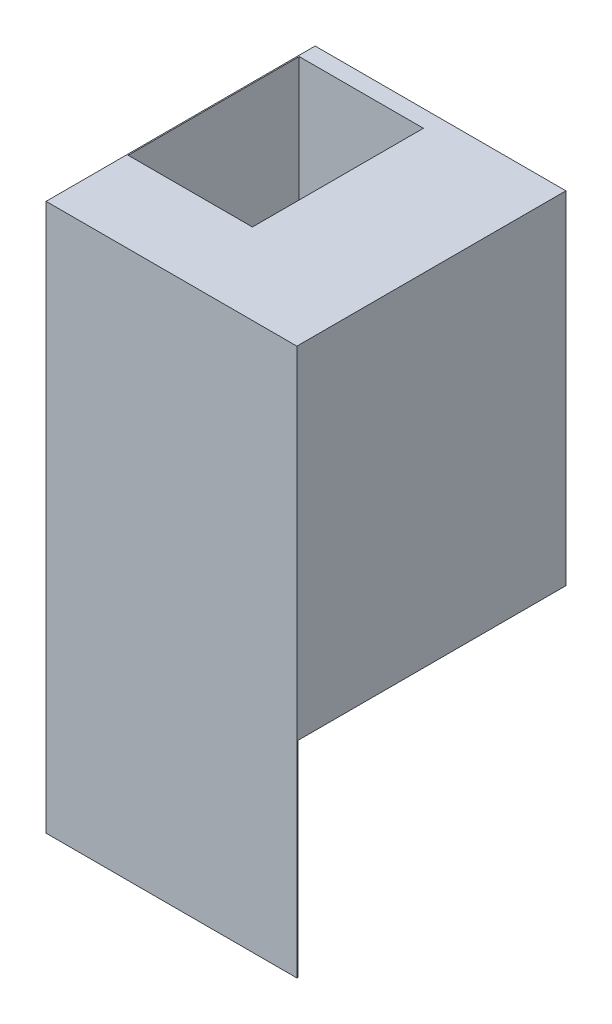
ISO-10303-21;
HEADER;
FILE_DESCRIPTION(('STEP AP214'),'2;1');
FILE_NAME('part.step','',(''),(''),'','','');
FILE_SCHEMA(('AUTOMOTIVE_DESIGN { 1 0 10303 214 1 1 1 1 }'));
ENDSEC;
DATA;
#1=APPLICATION_CONTEXT('core data for automotive mechanical design processes');
#2=APPLICATION_PROTOCOL_DEFINITION('international standard','automotive_design',2000,#1);
#3=PRODUCT_CONTEXT('',#1,'mechanical');
#4=PRODUCT('Part','Part','',(#3));
#5=PRODUCT_RELATED_PRODUCT_CATEGORY('part','',(#4));
#6=PRODUCT_DEFINITION_FORMATION('','',#4);
#7=PRODUCT_DEFINITION_CONTEXT('part definition',#1,'design');
#8=PRODUCT_DEFINITION('design','',#6,#7);
#9=PRODUCT_DEFINITION_SHAPE('','',#8);
#10=(LENGTH_UNIT() NAMED_UNIT(*) SI_UNIT(.MILLI.,.METRE.));
#11=(NAMED_UNIT(*) PLANE_ANGLE_UNIT() SI_UNIT($,.RADIAN.));
#12=(NAMED_UNIT(*) SI_UNIT($,.STERADIAN.) SOLID_ANGLE_UNIT());
#13=UNCERTAINTY_MEASURE_WITH_UNIT(LENGTH_MEASURE(1.E-05),#10,'distance_accuracy_value','');
#14=(GEOMETRIC_REPRESENTATION_CONTEXT(3) GLOBAL_UNCERTAINTY_ASSIGNED_CONTEXT((#13)) GLOBAL_UNIT_ASSIGNED_CONTEXT((#10,
#11,#12)) REPRESENTATION_CONTEXT('',''));
#15=CARTESIAN_POINT('',(0.,0.,0.));
#16=DIRECTION('',(0.,0.,1.));
#17=DIRECTION('',(1.,0.,0.));
#18=AXIS2_PLACEMENT_3D('',#15,#16,#17);
#19=CARTESIAN_POINT('',(0.,0.,0.));
#20=DIRECTION('',(0.,0.,-1.));
#21=DIRECTION('',(-1.,0.,0.));
#22=AXIS2_PLACEMENT_3D('',#19,#20,#21);
#23=PLANE('',#22);
#24=DIRECTION('',(1.,0.,0.));
#25=VECTOR('',#24,1.);
#26=CARTESIAN_POINT('',(-19.7567354025992,-134.460095901161,0.));
#27=LINE('',#26,#25);
#28=CARTESIAN_POINT('',(-9.7567354025992,-134.460095901161,0.));
#29=VERTEX_POINT('',#28);
#30=CARTESIAN_POINT('',(2180.2432645974,-134.460095901161,0.));
#31=VERTEX_POINT('',#30);
#32=EDGE_CURVE('E49',#29,#31,#27,.T.);
#33=ORIENTED_EDGE('',*,*,#32,.F.);
#34=DIRECTION('',(0.,1.,0.));
#35=VECTOR('',#34,1.);
#36=CARTESIAN_POINT('',(-9.75673540259921,-134.460095901161,0.));
#37=LINE('',#36,#35);
#38=CARTESIAN_POINT('',(-9.75673540259914,3665.53990409884,0.));
#39=VERTEX_POINT('',#38);
#40=EDGE_CURVE('E54',#29,#39,#37,.T.);
#41=ORIENTED_EDGE('',*,*,#40,.T.);
#42=DIRECTION('',(-1.,0.,0.));
#43=VECTOR('',#42,1.);
#44=CARTESIAN_POINT('',(1080.2432645974,3665.53990409884,0.));
#45=LINE('',#44,#43);
#46=CARTESIAN_POINT('',(1080.2432645974,3665.53990409884,0.));
#47=VERTEX_POINT('',#46);
#48=EDGE_CURVE('E317',#47,#39,#45,.T.);
#49=ORIENTED_EDGE('',*,*,#48,.F.);
#50=DIRECTION('',(0.,1.,0.));
#51=VECTOR('',#50,1.);
#52=CARTESIAN_POINT('',(1080.2432645974,4665.53990409884,0.));
#53=LINE('',#52,#51);
#54=CARTESIAN_POINT('',(1080.2432645974,3115.53990409884,0.));
#55=VERTEX_POINT('',#54);
#56=EDGE_CURVE('E287',#55,#47,#53,.T.);
#57=ORIENTED_EDGE('',*,*,#56,.F.);
#58=DIRECTION('',(-1.,0.,0.));
#59=VECTOR('',#58,1.);
#60=CARTESIAN_POINT('',(2180.2442645974,3115.53990409884,0.));
#61=LINE('',#60,#59);
#62=CARTESIAN_POINT('',(1090.2432645974,3115.53990409884,-3.5527136788005E-12));
#63=VERTEX_POINT('',#62);
#64=EDGE_CURVE('E249',#63,#55,#61,.T.);
#65=ORIENTED_EDGE('',*,*,#64,.F.);
#66=DIRECTION('',(0.,1.,0.));
#67=VECTOR('',#66,1.);
#68=CARTESIAN_POINT('',(1090.2432645974,1675.53990409884,-3.5527136788005E-12));
#69=LINE('',#68,#67);
#70=CARTESIAN_POINT('',(1090.2432645974,4655.53990409884,-3.5527136788005E-12));
#71=VERTEX_POINT('',#70);
#72=EDGE_CURVE('E266',#63,#71,#69,.T.);
#73=ORIENTED_EDGE('',*,*,#72,.T.);
#74=DIRECTION('',(1.,0.,0.));
#75=VECTOR('',#74,1.);
#76=CARTESIAN_POINT('',(2170.2432645974,4655.53990409884,-3.5527136788005E-12));
#77=LINE('',#76,#75);
#78=CARTESIAN_POINT('',(2170.2432645974,4655.53990409884,-3.5527136788005E-12));
#79=VERTEX_POINT('',#78);
#80=EDGE_CURVE('E270',#71,#79,#77,.T.);
#81=ORIENTED_EDGE('',*,*,#80,.T.);
#82=DIRECTION('',(0.,-1.,0.));
#83=VECTOR('',#82,1.);
#84=CARTESIAN_POINT('',(2170.2432645974,1675.53990409884,-3.5527136788005E-12));
#85=LINE('',#84,#83);
#86=CARTESIAN_POINT('',(2170.2432645974,1675.53990409884,-3.5527136788005E-12));
#87=VERTEX_POINT('',#86);
#88=EDGE_CURVE('E259',#79,#87,#85,.T.);
#89=ORIENTED_EDGE('',*,*,#88,.T.);
#90=DIRECTION('',(-1.,0.,0.));
#91=VECTOR('',#90,1.);
#92=CARTESIAN_POINT('',(2170.2432645974,1675.53990409884,-3.5527136788005E-12));
#93=LINE('',#92,#91);
#94=CARTESIAN_POINT('',(1090.2432645974,1675.53990409884,-3.5527136788005E-12));
#95=VERTEX_POINT('',#94);
#96=EDGE_CURVE('E262',#87,#95,#93,.T.);
#97=ORIENTED_EDGE('',*,*,#96,.T.);
#98=CARTESIAN_POINT('',(1090.2432645974,2215.53990409884,0.));
#99=VERTEX_POINT('',#98);
#100=EDGE_CURVE('E267',#95,#99,#69,.T.);
#101=ORIENTED_EDGE('',*,*,#100,.T.);
#102=DIRECTION('',(-1.,0.,0.));
#103=VECTOR('',#102,1.);
#104=CARTESIAN_POINT('',(2180.2442645974,2215.53990409884,0.));
#105=LINE('',#104,#103);
#106=CARTESIAN_POINT('',(1080.2432645974,2215.53990409884,0.));
#107=VERTEX_POINT('',#106);
#108=EDGE_CURVE('E246',#99,#107,#105,.T.);
#109=ORIENTED_EDGE('',*,*,#108,.T.);
#110=CARTESIAN_POINT('',(1080.2432645974,1665.53990409884,0.));
#111=VERTEX_POINT('',#110);
#112=EDGE_CURVE('E301',#111,#107,#53,.T.);
#113=ORIENTED_EDGE('',*,*,#112,.F.);
#114=DIRECTION('',(-1.,0.,0.));
#115=VECTOR('',#114,1.);
#116=CARTESIAN_POINT('',(2180.2432645974,1665.53990409884,0.));
#117=LINE('',#116,#115);
#118=CARTESIAN_POINT('',(2180.2432645974,1665.53990409884,0.));
#119=VERTEX_POINT('',#118);
#120=EDGE_CURVE('E300',#119,#111,#117,.T.);
#121=ORIENTED_EDGE('',*,*,#120,.F.);
#122=DIRECTION('',(0.,1.,0.));
#123=VECTOR('',#122,1.);
#124=CARTESIAN_POINT('',(2180.2432645974,-134.460095901161,0.));
#125=LINE('',#124,#123);
#126=EDGE_CURVE('E323',#31,#119,#125,.T.);
#127=ORIENTED_EDGE('',*,*,#126,.F.);
#128=EDGE_LOOP('',(#33,#41,#49,#57,#65,#73,#81,#89,#97,#101,#109,#113,#121,#127));
#129=FACE_BOUND('',#128,.T.);
#130=ADVANCED_FACE('F34',(#129),#23,.T.);
#131=CARTESIAN_POINT('',(1080.2432645974,3665.53990409884,0.));
#132=DIRECTION('',(0.,0.573462344363328,0.81923192051904));
#133=DIRECTION('',(0.,-0.819231920519041,0.573462344363328));
#134=AXIS2_PLACEMENT_3D('',#131,#132,#133);
#135=PLANE('',#134);
#136=DIRECTION('',(0.,0.81923192051904,-0.573462344363328));
#137=VECTOR('',#136,1.);
#138=CARTESIAN_POINT('',(-9.7567354025992,3665.53990409884,0.));
#139=LINE('',#138,#137);
#140=CARTESIAN_POINT('',(-9.75673540259914,4665.53990409884,-700.));
#141=VERTEX_POINT('',#140);
#142=EDGE_CURVE('E361',#39,#141,#139,.T.);
#143=ORIENTED_EDGE('',*,*,#142,.T.);
#144=DIRECTION('',(-1.,0.,0.));
#145=VECTOR('',#144,1.);
#146=CARTESIAN_POINT('',(1080.2432645974,4665.53990409884,-700.));
#147=LINE('',#146,#145);
#148=CARTESIAN_POINT('',(1080.2432645974,4665.53990409884,-700.));
#149=VERTEX_POINT('',#148);
#150=EDGE_CURVE('E314',#149,#141,#147,.T.);
#151=ORIENTED_EDGE('',*,*,#150,.F.);
#152=DIRECTION('',(0.,0.81923192051904,-0.573462344363328));
#153=VECTOR('',#152,1.);
#154=CARTESIAN_POINT('',(1080.2432645974,3665.53990409884,0.));
#155=LINE('',#154,#153);
#156=EDGE_CURVE('E311',#47,#149,#155,.T.);
#157=ORIENTED_EDGE('',*,*,#156,.F.);
#158=ORIENTED_EDGE('',*,*,#48,.T.);
#159=EDGE_LOOP('',(#143,#151,#157,#158));
#160=FACE_BOUND('',#159,.T.);
#161=ADVANCED_FACE('F365',(#160),#135,.F.);
#162=CARTESIAN_POINT('',(2180.2432645974,1665.53990409884,-2200.));
#163=DIRECTION('',(0.,1.,0.));
#164=DIRECTION('',(0.,0.,1.));
#165=AXIS2_PLACEMENT_3D('',#162,#163,#164);
#166=PLANE('',#165);
#167=DIRECTION('',(0.,0.,1.));
#168=VECTOR('',#167,1.);
#169=CARTESIAN_POINT('',(-9.75673540259914,1665.53990409884,-2200.));
#170=LINE('',#169,#168);
#171=CARTESIAN_POINT('',(-9.75673540259914,1665.53990409884,-2350.));
#172=VERTEX_POINT('',#171);
#173=CARTESIAN_POINT('',(-9.75673540259914,1665.53990409884,-2200.));
#174=VERTEX_POINT('',#173);
#175=EDGE_CURVE('E202',#172,#174,#170,.T.);
#176=ORIENTED_EDGE('',*,*,#175,.F.);
#177=DIRECTION('',(1.,0.,0.));
#178=VECTOR('',#177,1.);
#179=CARTESIAN_POINT('',(2180.2432645974,1665.53990409884,-2350.));
#180=LINE('',#179,#178);
#181=CARTESIAN_POINT('',(2180.2432645974,1665.53990409884,-2350.));
#182=VERTEX_POINT('',#181);
#183=EDGE_CURVE('E183',#172,#182,#180,.T.);
#184=ORIENTED_EDGE('',*,*,#183,.T.);
#185=DIRECTION('',(0.,0.,1.));
#186=VECTOR('',#185,1.);
#187=CARTESIAN_POINT('',(2180.2432645974,1665.53990409884,-2200.));
#188=LINE('',#187,#186);
#189=EDGE_CURVE('E307',#182,#119,#188,.T.);
#190=ORIENTED_EDGE('',*,*,#189,.T.);
#191=ORIENTED_EDGE('',*,*,#120,.T.);
#192=DIRECTION('',(0.,0.,1.));
#193=VECTOR('',#192,1.);
#194=CARTESIAN_POINT('',(1080.2432645974,1665.53990409884,-2200.));
#195=LINE('',#194,#193);
#196=CARTESIAN_POINT('',(1080.2432645974,1665.53990409884,-2200.));
#197=VERTEX_POINT('',#196);
#198=EDGE_CURVE('E299',#197,#111,#195,.T.);
#199=ORIENTED_EDGE('',*,*,#198,.F.);
#200=DIRECTION('',(-1.,0.,0.));
#201=VECTOR('',#200,1.);
#202=CARTESIAN_POINT('',(2180.2432645974,1665.53990409884,-2200.));
#203=LINE('',#202,#201);
#204=EDGE_CURVE('E204',#197,#174,#203,.T.);
#205=ORIENTED_EDGE('',*,*,#204,.T.);
#206=EDGE_LOOP('',(#176,#184,#190,#191,#199,#205));
#207=FACE_BOUND('',#206,.T.);
#208=ADVANCED_FACE('F345',(#207),#166,.F.);
#209=CARTESIAN_POINT('',(2180.2432645974,6870.64761121883,-2200.));
#210=DIRECTION('',(0.,0.,1.));
#211=DIRECTION('',(1.,0.,0.));
#212=AXIS2_PLACEMENT_3D('',#209,#210,#211);
#213=PLANE('',#212);
#214=DIRECTION('',(1.,0.,0.));
#215=VECTOR('',#214,1.);
#216=CARTESIAN_POINT('',(2180.2432645974,4665.53990409884,-2200.));
#217=LINE('',#216,#215);
#218=CARTESIAN_POINT('',(-9.75673540259914,4665.53990409884,-2200.));
#219=VERTEX_POINT('',#218);
#220=CARTESIAN_POINT('',(1080.2432645974,4665.53990409884,-2200.));
#221=VERTEX_POINT('',#220);
#222=EDGE_CURVE('E208',#219,#221,#217,.T.);
#223=ORIENTED_EDGE('',*,*,#222,.F.);
#224=DIRECTION('',(0.,-1.,0.));
#225=VECTOR('',#224,1.);
#226=CARTESIAN_POINT('',(-9.75673540259914,6870.64761121883,-2200.));
#227=LINE('',#226,#225);
#228=EDGE_CURVE('E194',#219,#174,#227,.T.);
#229=ORIENTED_EDGE('',*,*,#228,.T.);
#230=ORIENTED_EDGE('',*,*,#204,.F.);
#231=DIRECTION('',(0.,1.,0.));
#232=VECTOR('',#231,1.);
#233=CARTESIAN_POINT('',(1080.2432645974,4665.53990409884,-2200.));
#234=LINE('',#233,#232);
#235=EDGE_CURVE('E296',#197,#221,#234,.T.);
#236=ORIENTED_EDGE('',*,*,#235,.T.);
#237=EDGE_LOOP('',(#223,#229,#230,#236));
#238=FACE_BOUND('',#237,.T.);
#239=ADVANCED_FACE('F354',(#238),#213,.T.);
#240=CARTESIAN_POINT('',(-19.7567354025992,-134.460095901161,10.));
#241=DIRECTION('',(1.,0.,0.));
#242=DIRECTION('',(0.,1.,0.));
#243=AXIS2_PLACEMENT_3D('',#240,#241,#242);
#244=PLANE('',#243);
#245=DIRECTION('',(0.,-1.,0.));
#246=VECTOR('',#245,1.);
#247=CARTESIAN_POINT('',(-19.7567354025998,6870.64761121883,-2350.));
#248=LINE('',#247,#246);
#249=CARTESIAN_POINT('',(-19.7567354025998,4665.53990409884,-2350.));
#250=VERTEX_POINT('',#249);
#251=CARTESIAN_POINT('',(-19.7567354025992,-134.460095901161,-2350.));
#252=VERTEX_POINT('',#251);
#253=EDGE_CURVE('E213',#250,#252,#248,.T.);
#254=ORIENTED_EDGE('',*,*,#253,.T.);
#255=DIRECTION('',(0.,0.,-1.));
#256=VECTOR('',#255,1.);
#257=CARTESIAN_POINT('',(-19.7567354025992,-134.460095901161,10.));
#258=LINE('',#257,#256);
#259=CARTESIAN_POINT('',(-19.7567354025992,-134.460095901161,10.));
#260=VERTEX_POINT('',#259);
#261=EDGE_CURVE('E11',#260,#252,#258,.T.);
#262=ORIENTED_EDGE('',*,*,#261,.F.);
#263=DIRECTION('',(0.,-1.,0.));
#264=VECTOR('',#263,1.);
#265=CARTESIAN_POINT('',(-19.7567354025992,-134.460095901161,10.));
#266=LINE('',#265,#264);
#267=CARTESIAN_POINT('',(-19.7567354025992,4665.53990409884,10.));
#268=VERTEX_POINT('',#267);
#269=EDGE_CURVE('E319',#268,#260,#266,.T.);
#270=ORIENTED_EDGE('',*,*,#269,.F.);
#271=DIRECTION('',(0.,0.,-1.));
#272=VECTOR('',#271,1.);
#273=CARTESIAN_POINT('',(-19.7567354025992,4665.53990409884,10.));
#274=LINE('',#273,#272);
#275=EDGE_CURVE('E329',#268,#250,#274,.T.);
#276=ORIENTED_EDGE('',*,*,#275,.T.);
#277=EDGE_LOOP('',(#254,#262,#270,#276));
#278=FACE_BOUND('',#277,.T.);
#279=ADVANCED_FACE('F36',(#278),#244,.F.);
#280=CARTESIAN_POINT('',(-19.7567354025992,-134.460095901161,10.));
#281=DIRECTION('',(0.,1.,0.));
#282=DIRECTION('',(0.,0.,1.));
#283=AXIS2_PLACEMENT_3D('',#280,#281,#282);
#284=PLANE('',#283);
#285=ORIENTED_EDGE('',*,*,#261,.T.);
#286=DIRECTION('',(-1.,0.,0.));
#287=VECTOR('',#286,1.);
#288=CARTESIAN_POINT('',(-9.75673540259921,-134.460095901161,-2350.));
#289=LINE('',#288,#287);
#290=CARTESIAN_POINT('',(-9.75673540259921,-134.460095901161,-2350.));
#291=VERTEX_POINT('',#290);
#292=EDGE_CURVE('E181',#291,#252,#289,.T.);
#293=ORIENTED_EDGE('',*,*,#292,.F.);
#294=DIRECTION('',(0.,0.,1.));
#295=VECTOR('',#294,1.);
#296=CARTESIAN_POINT('',(-9.75673540259921,-134.460095901161,-2350.));
#297=LINE('',#296,#295);
#298=EDGE_CURVE('E187',#291,#29,#297,.T.);
#299=ORIENTED_EDGE('',*,*,#298,.T.);
#300=ORIENTED_EDGE('',*,*,#32,.T.);
#301=DIRECTION('',(0.,0.,-1.));
#302=VECTOR('',#301,1.);
#303=CARTESIAN_POINT('',(2180.2432645974,-134.460095901161,10.));
#304=LINE('',#303,#302);
#305=CARTESIAN_POINT('',(2180.2432645974,-134.460095901161,10.));
#306=VERTEX_POINT('',#305);
#307=EDGE_CURVE('E42',#306,#31,#304,.T.);
#308=ORIENTED_EDGE('',*,*,#307,.F.);
#309=DIRECTION('',(1.,0.,0.));
#310=VECTOR('',#309,1.);
#311=CARTESIAN_POINT('',(-19.7567354025992,-134.460095901161,10.));
#312=LINE('',#311,#310);
#313=EDGE_CURVE('E322',#260,#306,#312,.T.);
#314=ORIENTED_EDGE('',*,*,#313,.F.);
#315=EDGE_LOOP('',(#285,#293,#299,#300,#308,#314));
#316=FACE_BOUND('',#315,.T.);
#317=ADVANCED_FACE('F191',(#316),#284,.F.);
#318=CARTESIAN_POINT('',(2180.2432645974,-134.460095901161,10.));
#319=DIRECTION('',(-1.,0.,0.));
#320=DIRECTION('',(0.,0.,1.));
#321=AXIS2_PLACEMENT_3D('',#318,#319,#320);
#322=PLANE('',#321);
#323=ORIENTED_EDGE('',*,*,#126,.T.);
#324=ORIENTED_EDGE('',*,*,#189,.F.);
#325=DIRECTION('',(0.,-1.,0.));
#326=VECTOR('',#325,1.);
#327=CARTESIAN_POINT('',(2180.2432645974,6870.64761121883,-2350.));
#328=LINE('',#327,#326);
#329=CARTESIAN_POINT('',(2180.2432645974,4665.53990409884,-2350.));
#330=VERTEX_POINT('',#329);
#331=EDGE_CURVE('E209',#330,#182,#328,.T.);
#332=ORIENTED_EDGE('',*,*,#331,.F.);
#333=DIRECTION('',(0.,0.,-1.));
#334=VECTOR('',#333,1.);
#335=CARTESIAN_POINT('',(2180.2432645974,4665.53990409884,10.));
#336=LINE('',#335,#334);
#337=CARTESIAN_POINT('',(2180.2432645974,4665.53990409884,10.));
#338=VERTEX_POINT('',#337);
#339=EDGE_CURVE('E334',#338,#330,#336,.T.);
#340=ORIENTED_EDGE('',*,*,#339,.F.);
#341=DIRECTION('',(0.,1.,0.));
#342=VECTOR('',#341,1.);
#343=CARTESIAN_POINT('',(2180.2432645974,-134.460095901161,10.));
#344=LINE('',#343,#342);
#345=EDGE_CURVE('E325',#306,#338,#344,.T.);
#346=ORIENTED_EDGE('',*,*,#345,.F.);
#347=ORIENTED_EDGE('',*,*,#307,.T.);
#348=EDGE_LOOP('',(#323,#324,#332,#340,#346,#347));
#349=FACE_BOUND('',#348,.T.);
#350=ADVANCED_FACE('F339',(#349),#322,.F.);
#351=CARTESIAN_POINT('',(-19.7567354025992,4665.53990409884,10.));
#352=DIRECTION('',(0.,-1.,0.));
#353=DIRECTION('',(0.,0.,-1.));
#354=AXIS2_PLACEMENT_3D('',#351,#352,#353);
#355=PLANE('',#354);
#356=DIRECTION('',(-1.,0.,0.));
#357=VECTOR('',#356,1.);
#358=CARTESIAN_POINT('',(2180.2432645974,4665.53990409884,-2350.));
#359=LINE('',#358,#357);
#360=EDGE_CURVE('E205',#330,#250,#359,.T.);
#361=ORIENTED_EDGE('',*,*,#360,.T.);
#362=ORIENTED_EDGE('',*,*,#275,.F.);
#363=DIRECTION('',(-1.,0.,0.));
#364=VECTOR('',#363,1.);
#365=CARTESIAN_POINT('',(-19.7567354025992,4665.53990409884,10.));
#366=LINE('',#365,#364);
#367=EDGE_CURVE('E327',#338,#268,#366,.T.);
#368=ORIENTED_EDGE('',*,*,#367,.F.);
#369=ORIENTED_EDGE('',*,*,#339,.T.);
#370=EDGE_LOOP('',(#361,#362,#368,#369));
#371=FACE_BOUND('',#370,.T.);
#372=DIRECTION('',(0.,0.,-1.));
#373=VECTOR('',#372,1.);
#374=CARTESIAN_POINT('',(-9.7567354025992,4665.53990409884,-700.));
#375=LINE('',#374,#373);
#376=EDGE_CURVE('E188',#141,#219,#375,.T.);
#377=ORIENTED_EDGE('',*,*,#376,.T.);
#378=ORIENTED_EDGE('',*,*,#222,.T.);
#379=DIRECTION('',(0.,0.,1.));
#380=VECTOR('',#379,1.);
#381=CARTESIAN_POINT('',(1080.2432645974,4665.53990409884,-2200.));
#382=LINE('',#381,#380);
#383=EDGE_CURVE('E309',#221,#149,#382,.T.);
#384=ORIENTED_EDGE('',*,*,#383,.T.);
#385=ORIENTED_EDGE('',*,*,#150,.T.);
#386=EDGE_LOOP('',(#377,#378,#384,#385));
#387=FACE_BOUND('',#386,.T.);
#388=ADVANCED_FACE('F359',(#371,#387),#355,.F.);
#389=CARTESIAN_POINT('',(0.,0.,10.));
#390=DIRECTION('',(0.,0.,-1.));
#391=DIRECTION('',(-1.,0.,0.));
#392=AXIS2_PLACEMENT_3D('',#389,#390,#391);
#393=PLANE('',#392);
#394=ORIENTED_EDGE('',*,*,#269,.T.);
#395=ORIENTED_EDGE('',*,*,#313,.T.);
#396=ORIENTED_EDGE('',*,*,#345,.T.);
#397=ORIENTED_EDGE('',*,*,#367,.T.);
#398=EDGE_LOOP('',(#394,#395,#396,#397));
#399=FACE_BOUND('',#398,.T.);
#400=ADVANCED_FACE('F417',(#399),#393,.F.);
#401=CARTESIAN_POINT('',(1080.2432645974,4665.53990409884,-2200.));
#402=DIRECTION('',(1.,0.,0.));
#403=DIRECTION('',(0.,1.,0.));
#404=AXIS2_PLACEMENT_3D('',#401,#402,#403);
#405=PLANE('',#404);
#406=CARTESIAN_POINT('',(1080.2432645974,2765.53990409884,-1450.));
#407=DIRECTION('',(-1.,0.,0.));
#408=DIRECTION('',(0.,-1.,0.));
#409=AXIS2_PLACEMENT_3D('',#406,#407,#408);
#410=CIRCLE('',#409,350.);
#411=CARTESIAN_POINT('',(1080.2432645974,3115.53990409884,-1450.));
#412=VERTEX_POINT('',#411);
#413=CARTESIAN_POINT('',(1080.2432645974,2765.53990409884,-1800.));
#414=VERTEX_POINT('',#413);
#415=EDGE_CURVE('E231',#412,#414,#410,.T.);
#416=ORIENTED_EDGE('',*,*,#415,.F.);
#417=DIRECTION('',(0.,0.,-1.));
#418=VECTOR('',#417,1.);
#419=CARTESIAN_POINT('',(1080.2432645974,3115.53990409884,0.));
#420=LINE('',#419,#418);
#421=EDGE_CURVE('E220',#55,#412,#420,.T.);
#422=ORIENTED_EDGE('',*,*,#421,.F.);
#423=ORIENTED_EDGE('',*,*,#56,.T.);
#424=ORIENTED_EDGE('',*,*,#156,.T.);
#425=ORIENTED_EDGE('',*,*,#383,.F.);
#426=ORIENTED_EDGE('',*,*,#235,.F.);
#427=ORIENTED_EDGE('',*,*,#198,.T.);
#428=ORIENTED_EDGE('',*,*,#112,.T.);
#429=DIRECTION('',(0.,0.,1.));
#430=VECTOR('',#429,1.);
#431=CARTESIAN_POINT('',(1080.2432645974,2215.53990409884,0.));
#432=LINE('',#431,#430);
#433=CARTESIAN_POINT('',(1080.2432645974,2215.53990409884,-1450.));
#434=VERTEX_POINT('',#433);
#435=EDGE_CURVE('E222',#434,#107,#432,.T.);
#436=ORIENTED_EDGE('',*,*,#435,.F.);
#437=CARTESIAN_POINT('',(1080.2432645974,2565.53990409884,-1450.));
#438=DIRECTION('',(-1.,0.,0.));
#439=DIRECTION('',(0.,1.,0.));
#440=AXIS2_PLACEMENT_3D('',#437,#438,#439);
#441=CIRCLE('',#440,350.);
#442=CARTESIAN_POINT('',(1080.2432645974,2565.53990409884,-1800.));
#443=VERTEX_POINT('',#442);
#444=EDGE_CURVE('E225',#443,#434,#441,.T.);
#445=ORIENTED_EDGE('',*,*,#444,.F.);
#446=DIRECTION('',(0.,-1.,0.));
#447=VECTOR('',#446,1.);
#448=CARTESIAN_POINT('',(1080.2432645974,2565.53990409884,-1800.));
#449=LINE('',#448,#447);
#450=EDGE_CURVE('E228',#414,#443,#449,.T.);
#451=ORIENTED_EDGE('',*,*,#450,.F.);
#452=EDGE_LOOP('',(#416,#422,#423,#424,#425,#426,#427,#428,#436,#445,#451));
#453=FACE_BOUND('',#452,.T.);
#454=ADVANCED_FACE('F349',(#453),#405,.F.);
#455=CARTESIAN_POINT('',(2170.2432645974,1675.53990409884,-3.5527136788005E-12));
#456=DIRECTION('',(1.,0.,0.));
#457=DIRECTION('',(0.,0.,-1.));
#458=AXIS2_PLACEMENT_3D('',#455,#456,#457);
#459=PLANE('',#458);
#460=DIRECTION('',(0.,-1.,0.));
#461=VECTOR('',#460,1.);
#462=CARTESIAN_POINT('',(2170.2432645974,1675.53990409884,-2200.));
#463=LINE('',#462,#461);
#464=CARTESIAN_POINT('',(2170.2432645974,4655.53990409884,-2200.));
#465=VERTEX_POINT('',#464);
#466=CARTESIAN_POINT('',(2170.2432645974,1675.53990409884,-2200.));
#467=VERTEX_POINT('',#466);
#468=EDGE_CURVE('E258',#465,#467,#463,.T.);
#469=ORIENTED_EDGE('',*,*,#468,.T.);
#470=DIRECTION('',(0.,0.,-1.));
#471=VECTOR('',#470,1.);
#472=CARTESIAN_POINT('',(2170.2432645974,1675.53990409884,-3.5527136788005E-12));
#473=LINE('',#472,#471);
#474=EDGE_CURVE('E273',#87,#467,#473,.T.);
#475=ORIENTED_EDGE('',*,*,#474,.F.);
#476=ORIENTED_EDGE('',*,*,#88,.F.);
#477=DIRECTION('',(0.,0.,-1.));
#478=VECTOR('',#477,1.);
#479=CARTESIAN_POINT('',(2170.2432645974,4655.53990409884,-3.5527136788005E-12));
#480=LINE('',#479,#478);
#481=EDGE_CURVE('E284',#79,#465,#480,.T.);
#482=ORIENTED_EDGE('',*,*,#481,.T.);
#483=EDGE_LOOP('',(#469,#475,#476,#482));
#484=FACE_BOUND('',#483,.T.);
#485=ADVANCED_FACE('F385',(#484),#459,.F.);
#486=CARTESIAN_POINT('',(2170.2432645974,4655.53990409884,-3.5527136788005E-12));
#487=DIRECTION('',(0.,1.,0.));
#488=DIRECTION('',(0.,0.,1.));
#489=AXIS2_PLACEMENT_3D('',#486,#487,#488);
#490=PLANE('',#489);
#491=DIRECTION('',(1.,0.,0.));
#492=VECTOR('',#491,1.);
#493=CARTESIAN_POINT('',(2170.2432645974,4655.53990409884,-2200.));
#494=LINE('',#493,#492);
#495=CARTESIAN_POINT('',(1090.2432645974,4655.53990409884,-2200.));
#496=VERTEX_POINT('',#495);
#497=EDGE_CURVE('E263',#496,#465,#494,.T.);
#498=ORIENTED_EDGE('',*,*,#497,.T.);
#499=ORIENTED_EDGE('',*,*,#481,.F.);
#500=ORIENTED_EDGE('',*,*,#80,.F.);
#501=DIRECTION('',(0.,0.,-1.));
#502=VECTOR('',#501,1.);
#503=CARTESIAN_POINT('',(1090.2432645974,4655.53990409884,-3.5527136788005E-12));
#504=LINE('',#503,#502);
#505=EDGE_CURVE('E288',#71,#496,#504,.T.);
#506=ORIENTED_EDGE('',*,*,#505,.T.);
#507=EDGE_LOOP('',(#498,#499,#500,#506));
#508=FACE_BOUND('',#507,.T.);
#509=ADVANCED_FACE('F383',(#508),#490,.F.);
#510=CARTESIAN_POINT('',(1090.2432645974,1675.53990409884,-3.5527136788005E-12));
#511=DIRECTION('',(-1.,0.,0.));
#512=DIRECTION('',(0.,0.,1.));
#513=AXIS2_PLACEMENT_3D('',#510,#511,#512);
#514=PLANE('',#513);
#515=ORIENTED_EDGE('',*,*,#72,.F.);
#516=DIRECTION('',(0.,0.,1.));
#517=VECTOR('',#516,1.);
#518=CARTESIAN_POINT('',(1090.2432645974,3115.53990409884,0.));
#519=LINE('',#518,#517);
#520=CARTESIAN_POINT('',(1090.2432645974,3115.53990409884,-1450.));
#521=VERTEX_POINT('',#520);
#522=EDGE_CURVE('E218',#521,#63,#519,.T.);
#523=ORIENTED_EDGE('',*,*,#522,.F.);
#524=CARTESIAN_POINT('',(1090.2432645974,2765.53990409884,-1450.));
#525=DIRECTION('',(-1.,0.,0.));
#526=DIRECTION('',(0.,0.,1.));
#527=AXIS2_PLACEMENT_3D('',#524,#525,#526);
#528=CIRCLE('',#527,350.);
#529=CARTESIAN_POINT('',(1090.2432645974,2765.53990409884,-1800.));
#530=VERTEX_POINT('',#529);
#531=EDGE_CURVE('E221',#530,#521,#528,.F.);
#532=ORIENTED_EDGE('',*,*,#531,.F.);
#533=DIRECTION('',(0.,1.,0.));
#534=VECTOR('',#533,1.);
#535=CARTESIAN_POINT('',(1090.2432645974,2565.53990409884,-1800.));
#536=LINE('',#535,#534);
#537=CARTESIAN_POINT('',(1090.2432645974,2565.53990409884,-1800.));
#538=VERTEX_POINT('',#537);
#539=EDGE_CURVE('E241',#538,#530,#536,.T.);
#540=ORIENTED_EDGE('',*,*,#539,.F.);
#541=CARTESIAN_POINT('',(1090.2432645974,2565.53990409884,-1450.));
#542=DIRECTION('',(-1.,0.,0.));
#543=DIRECTION('',(0.,0.,1.));
#544=AXIS2_PLACEMENT_3D('',#541,#542,#543);
#545=CIRCLE('',#544,350.);
#546=CARTESIAN_POINT('',(1090.2432645974,2215.53990409884,-1450.));
#547=VERTEX_POINT('',#546);
#548=EDGE_CURVE('E238',#547,#538,#545,.F.);
#549=ORIENTED_EDGE('',*,*,#548,.F.);
#550=DIRECTION('',(0.,0.,-1.));
#551=VECTOR('',#550,1.);
#552=CARTESIAN_POINT('',(1090.2432645974,2215.53990409884,0.));
#553=LINE('',#552,#551);
#554=EDGE_CURVE('E217',#99,#547,#553,.T.);
#555=ORIENTED_EDGE('',*,*,#554,.F.);
#556=ORIENTED_EDGE('',*,*,#100,.F.);
#557=DIRECTION('',(0.,0.,-1.));
#558=VECTOR('',#557,1.);
#559=CARTESIAN_POINT('',(1090.2432645974,1675.53990409884,-3.5527136788005E-12));
#560=LINE('',#559,#558);
#561=CARTESIAN_POINT('',(1090.2432645974,1675.53990409884,-2200.));
#562=VERTEX_POINT('',#561);
#563=EDGE_CURVE('E291',#95,#562,#560,.T.);
#564=ORIENTED_EDGE('',*,*,#563,.T.);
#565=DIRECTION('',(0.,1.,0.));
#566=VECTOR('',#565,1.);
#567=CARTESIAN_POINT('',(1090.2432645974,1675.53990409884,-2200.));
#568=LINE('',#567,#566);
#569=EDGE_CURVE('E279',#562,#496,#568,.T.);
#570=ORIENTED_EDGE('',*,*,#569,.T.);
#571=ORIENTED_EDGE('',*,*,#505,.F.);
#572=EDGE_LOOP('',(#515,#523,#532,#540,#549,#555,#556,#564,#570,#571));
#573=FACE_BOUND('',#572,.T.);
#574=ADVANCED_FACE('F377',(#573),#514,.F.);
#575=CARTESIAN_POINT('',(2170.2432645974,1675.53990409884,-3.5527136788005E-12));
#576=DIRECTION('',(0.,-1.,0.));
#577=DIRECTION('',(0.,0.,-1.));
#578=AXIS2_PLACEMENT_3D('',#575,#576,#577);
#579=PLANE('',#578);
#580=DIRECTION('',(-1.,0.,0.));
#581=VECTOR('',#580,1.);
#582=CARTESIAN_POINT('',(2170.2432645974,1675.53990409884,-2200.));
#583=LINE('',#582,#581);
#584=EDGE_CURVE('E276',#467,#562,#583,.T.);
#585=ORIENTED_EDGE('',*,*,#584,.T.);
#586=ORIENTED_EDGE('',*,*,#563,.F.);
#587=ORIENTED_EDGE('',*,*,#96,.F.);
#588=ORIENTED_EDGE('',*,*,#474,.T.);
#589=EDGE_LOOP('',(#585,#586,#587,#588));
#590=FACE_BOUND('',#589,.T.);
#591=ADVANCED_FACE('F388',(#590),#579,.F.);
#592=CARTESIAN_POINT('',(2180.2442645974,3115.53990409884,0.));
#593=DIRECTION('',(0.,1.,0.));
#594=DIRECTION('',(-1.,0.,0.));
#595=AXIS2_PLACEMENT_3D('',#592,#593,#594);
#596=PLANE('',#595);
#597=ORIENTED_EDGE('',*,*,#522,.T.);
#598=ORIENTED_EDGE('',*,*,#64,.T.);
#599=ORIENTED_EDGE('',*,*,#421,.T.);
#600=DIRECTION('',(-1.,0.,0.));
#601=VECTOR('',#600,1.);
#602=CARTESIAN_POINT('',(2180.2442645974,3115.53990409884,-1450.));
#603=LINE('',#602,#601);
#604=EDGE_CURVE('E224',#521,#412,#603,.T.);
#605=ORIENTED_EDGE('',*,*,#604,.F.);
#606=EDGE_LOOP('',(#597,#598,#599,#605));
#607=FACE_BOUND('',#606,.T.);
#608=ADVANCED_FACE('F373',(#607),#596,.F.);
#609=CARTESIAN_POINT('',(2180.2442645974,2765.53990409884,-1450.));
#610=DIRECTION('',(-1.,0.,0.));
#611=DIRECTION('',(0.,-1.,0.));
#612=AXIS2_PLACEMENT_3D('',#609,#610,#611);
#613=CYLINDRICAL_SURFACE('',#612,350.);
#614=ORIENTED_EDGE('',*,*,#531,.T.);
#615=ORIENTED_EDGE('',*,*,#604,.T.);
#616=ORIENTED_EDGE('',*,*,#415,.T.);
#617=DIRECTION('',(-1.,0.,0.));
#618=VECTOR('',#617,1.);
#619=CARTESIAN_POINT('',(2180.2442645974,2765.53990409884,-1800.));
#620=LINE('',#619,#618);
#621=EDGE_CURVE('E254',#530,#414,#620,.T.);
#622=ORIENTED_EDGE('',*,*,#621,.F.);
#623=EDGE_LOOP('',(#614,#615,#616,#622));
#624=FACE_BOUND('',#623,.T.);
#625=ADVANCED_FACE('F400',(#624),#613,.F.);
#626=CARTESIAN_POINT('',(2180.2442645974,2565.53990409884,-1800.));
#627=DIRECTION('',(0.,0.,-1.));
#628=DIRECTION('',(-1.,0.,0.));
#629=AXIS2_PLACEMENT_3D('',#626,#627,#628);
#630=PLANE('',#629);
#631=ORIENTED_EDGE('',*,*,#539,.T.);
#632=ORIENTED_EDGE('',*,*,#621,.T.);
#633=ORIENTED_EDGE('',*,*,#450,.T.);
#634=DIRECTION('',(-1.,0.,0.));
#635=VECTOR('',#634,1.);
#636=CARTESIAN_POINT('',(2180.2442645974,2565.53990409884,-1800.));
#637=LINE('',#636,#635);
#638=EDGE_CURVE('E252',#538,#443,#637,.T.);
#639=ORIENTED_EDGE('',*,*,#638,.F.);
#640=EDGE_LOOP('',(#631,#632,#633,#639));
#641=FACE_BOUND('',#640,.T.);
#642=ADVANCED_FACE('F398',(#641),#630,.F.);
#643=CARTESIAN_POINT('',(2180.2442645974,2565.53990409884,-1450.));
#644=DIRECTION('',(-1.,0.,0.));
#645=DIRECTION('',(0.,-1.,0.));
#646=AXIS2_PLACEMENT_3D('',#643,#644,#645);
#647=CYLINDRICAL_SURFACE('',#646,350.);
#648=ORIENTED_EDGE('',*,*,#548,.T.);
#649=ORIENTED_EDGE('',*,*,#638,.T.);
#650=ORIENTED_EDGE('',*,*,#444,.T.);
#651=DIRECTION('',(-1.,0.,0.));
#652=VECTOR('',#651,1.);
#653=CARTESIAN_POINT('',(2180.2442645974,2215.53990409884,-1450.));
#654=LINE('',#653,#652);
#655=EDGE_CURVE('E250',#547,#434,#654,.T.);
#656=ORIENTED_EDGE('',*,*,#655,.F.);
#657=EDGE_LOOP('',(#648,#649,#650,#656));
#658=FACE_BOUND('',#657,.T.);
#659=ADVANCED_FACE('F396',(#658),#647,.F.);
#660=CARTESIAN_POINT('',(2180.2442645974,2215.53990409884,0.));
#661=DIRECTION('',(0.,-1.,0.));
#662=DIRECTION('',(1.,0.,0.));
#663=AXIS2_PLACEMENT_3D('',#660,#661,#662);
#664=PLANE('',#663);
#665=ORIENTED_EDGE('',*,*,#554,.T.);
#666=ORIENTED_EDGE('',*,*,#655,.T.);
#667=ORIENTED_EDGE('',*,*,#435,.T.);
#668=ORIENTED_EDGE('',*,*,#108,.F.);
#669=EDGE_LOOP('',(#665,#666,#667,#668));
#670=FACE_BOUND('',#669,.T.);
#671=ADVANCED_FACE('F393',(#670),#664,.F.);
#672=CARTESIAN_POINT('',(2180.2432645974,6870.64761121883,-2350.));
#673=DIRECTION('',(0.,0.,-1.));
#674=DIRECTION('',(-1.,0.,0.));
#675=AXIS2_PLACEMENT_3D('',#672,#673,#674);
#676=PLANE('',#675);
#677=ORIENTED_EDGE('',*,*,#253,.F.);
#678=ORIENTED_EDGE('',*,*,#360,.F.);
#679=ORIENTED_EDGE('',*,*,#331,.T.);
#680=ORIENTED_EDGE('',*,*,#183,.F.);
#681=DIRECTION('',(0.,-1.,0.));
#682=VECTOR('',#681,1.);
#683=CARTESIAN_POINT('',(-9.7567354025992,4665.53990409884,-2350.));
#684=LINE('',#683,#682);
#685=EDGE_CURVE('E177',#172,#291,#684,.T.);
#686=ORIENTED_EDGE('',*,*,#685,.T.);
#687=ORIENTED_EDGE('',*,*,#292,.T.);
#688=EDGE_LOOP('',(#677,#678,#679,#680,#686,#687));
#689=FACE_BOUND('',#688,.T.);
#690=ADVANCED_FACE('F180',(#689),#676,.T.);
#691=ORIENTED_EDGE('',*,*,#468,.F.);
#692=ORIENTED_EDGE('',*,*,#497,.F.);
#693=ORIENTED_EDGE('',*,*,#569,.F.);
#694=ORIENTED_EDGE('',*,*,#584,.F.);
#695=EDGE_LOOP('',(#691,#692,#693,#694));
#696=FACE_BOUND('',#695,.T.);
#697=ADVANCED_FACE('F431',(#696),#213,.T.);
#698=CARTESIAN_POINT('',(-9.75673540259921,0.,0.));
#699=DIRECTION('',(-1.,0.,0.));
#700=DIRECTION('',(0.,-1.,0.));
#701=AXIS2_PLACEMENT_3D('',#698,#699,#700);
#702=PLANE('',#701);
#703=ORIENTED_EDGE('',*,*,#685,.F.);
#704=ORIENTED_EDGE('',*,*,#175,.T.);
#705=ORIENTED_EDGE('',*,*,#228,.F.);
#706=ORIENTED_EDGE('',*,*,#376,.F.);
#707=ORIENTED_EDGE('',*,*,#142,.F.);
#708=ORIENTED_EDGE('',*,*,#40,.F.);
#709=ORIENTED_EDGE('',*,*,#298,.F.);
#710=EDGE_LOOP('',(#703,#704,#705,#706,#707,#708,#709));
#711=FACE_BOUND('',#710,.T.);
#712=ADVANCED_FACE('F196',(#711),#702,.F.);
#713=CLOSED_SHELL('',(#130,#161,#208,#239,#279,#317,#350,#388,#400,#454,#485,#509,#574,#591,
#608,#625,#642,#659,#671,#690,#697,#712));
#714=MANIFOLD_SOLID_BREP('B2',#713);
#715=ADVANCED_BREP_SHAPE_REPRESENTATION('',(#18,#714),#14);
#716=SHAPE_DEFINITION_REPRESENTATION(#9,#715);
ENDSEC;
END-ISO-10303-21;
